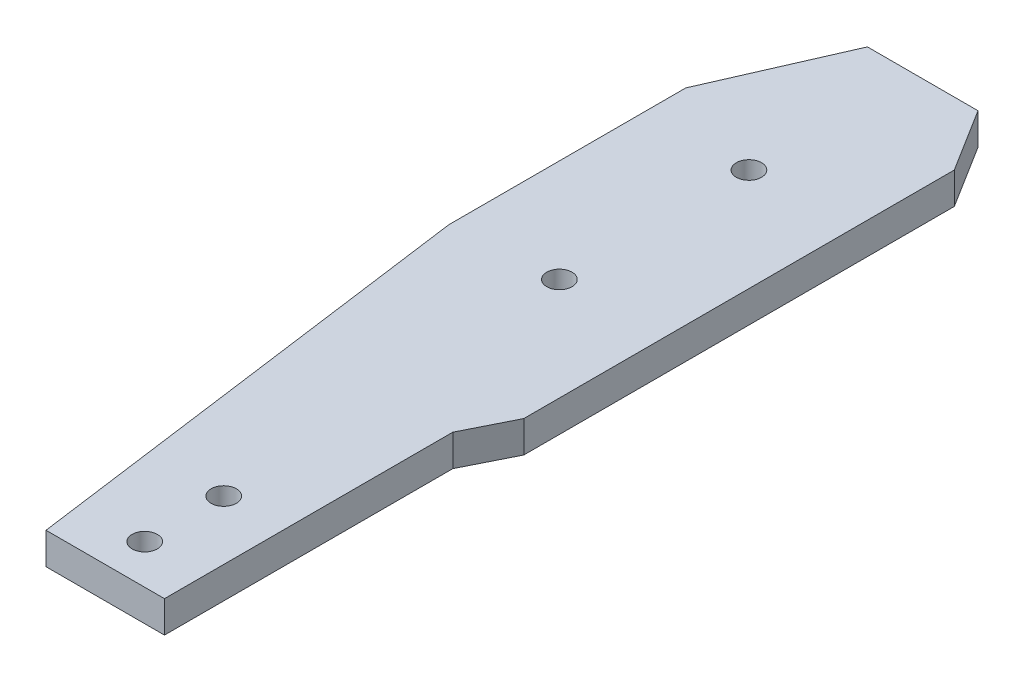
ISO-10303-21;
HEADER;
FILE_DESCRIPTION(('STEP AP214'),'2;1');
FILE_NAME('part.step','',(''),(''),'','','');
FILE_SCHEMA(('AUTOMOTIVE_DESIGN { 1 0 10303 214 1 1 1 1 }'));
ENDSEC;
DATA;
#1=APPLICATION_CONTEXT('core data for automotive mechanical design processes');
#2=APPLICATION_PROTOCOL_DEFINITION('international standard','automotive_design',2000,#1);
#3=PRODUCT_CONTEXT('',#1,'mechanical');
#4=PRODUCT('Part','Part','',(#3));
#5=PRODUCT_RELATED_PRODUCT_CATEGORY('part','',(#4));
#6=PRODUCT_DEFINITION_FORMATION('','',#4);
#7=PRODUCT_DEFINITION_CONTEXT('part definition',#1,'design');
#8=PRODUCT_DEFINITION('design','',#6,#7);
#9=PRODUCT_DEFINITION_SHAPE('','',#8);
#10=(LENGTH_UNIT() NAMED_UNIT(*) SI_UNIT(.MILLI.,.METRE.));
#11=(NAMED_UNIT(*) PLANE_ANGLE_UNIT() SI_UNIT($,.RADIAN.));
#12=(NAMED_UNIT(*) SI_UNIT($,.STERADIAN.) SOLID_ANGLE_UNIT());
#13=UNCERTAINTY_MEASURE_WITH_UNIT(LENGTH_MEASURE(1.E-05),#10,'distance_accuracy_value','');
#14=(GEOMETRIC_REPRESENTATION_CONTEXT(3) GLOBAL_UNCERTAINTY_ASSIGNED_CONTEXT((#13)) GLOBAL_UNIT_ASSIGNED_CONTEXT((#10,
#11,#12)) REPRESENTATION_CONTEXT('',''));
#15=CARTESIAN_POINT('',(0.,0.,0.));
#16=DIRECTION('',(0.,0.,1.));
#17=DIRECTION('',(1.,0.,0.));
#18=AXIS2_PLACEMENT_3D('',#15,#16,#17);
#19=CARTESIAN_POINT('',(-26.,4.,38.));
#20=DIRECTION('',(-1.,0.,0.));
#21=DIRECTION('',(0.,0.,1.));
#22=AXIS2_PLACEMENT_3D('',#19,#20,#21);
#23=PLANE('',#22);
#24=DIRECTION('',(0.,0.,-1.));
#25=VECTOR('',#24,1.);
#26=CARTESIAN_POINT('',(-26.,0.,38.));
#27=LINE('',#26,#25);
#28=CARTESIAN_POINT('',(-26.,0.,38.));
#29=VERTEX_POINT('',#28);
#30=CARTESIAN_POINT('',(-26.,0.,8.));
#31=VERTEX_POINT('',#30);
#32=EDGE_CURVE('E140',#29,#31,#27,.T.);
#33=ORIENTED_EDGE('',*,*,#32,.F.);
#34=DIRECTION('',(0.,-1.,0.));
#35=VECTOR('',#34,1.);
#36=CARTESIAN_POINT('',(-26.,4.,38.));
#37=LINE('',#36,#35);
#38=CARTESIAN_POINT('',(-26.,4.,38.));
#39=VERTEX_POINT('',#38);
#40=EDGE_CURVE('E11',#39,#29,#37,.T.);
#41=ORIENTED_EDGE('',*,*,#40,.F.);
#42=DIRECTION('',(0.,0.,-1.));
#43=VECTOR('',#42,1.);
#44=CARTESIAN_POINT('',(-26.,4.,38.));
#45=LINE('',#44,#43);
#46=CARTESIAN_POINT('',(-26.,4.,8.));
#47=VERTEX_POINT('',#46);
#48=EDGE_CURVE('E164',#39,#47,#45,.T.);
#49=ORIENTED_EDGE('',*,*,#48,.T.);
#50=DIRECTION('',(0.,-1.,0.));
#51=VECTOR('',#50,1.);
#52=CARTESIAN_POINT('',(-26.,4.,8.));
#53=LINE('',#52,#51);
#54=EDGE_CURVE('E40',#47,#31,#53,.T.);
#55=ORIENTED_EDGE('',*,*,#54,.T.);
#56=EDGE_LOOP('',(#33,#41,#49,#55));
#57=FACE_BOUND('',#56,.T.);
#58=ADVANCED_FACE('F37',(#57),#23,.T.);
#59=CARTESIAN_POINT('',(-18.,4.,97.));
#60=DIRECTION('',(-0.990932088180138,0.,0.134363672973578));
#61=DIRECTION('',(0.134363672973578,0.,0.990932088180138));
#62=AXIS2_PLACEMENT_3D('',#59,#60,#61);
#63=PLANE('',#62);
#64=DIRECTION('',(-0.134363672973578,0.,-0.990932088180138));
#65=VECTOR('',#64,1.);
#66=CARTESIAN_POINT('',(-18.,0.,97.));
#67=LINE('',#66,#65);
#68=CARTESIAN_POINT('',(-18.,0.,97.));
#69=VERTEX_POINT('',#68);
#70=EDGE_CURVE('E162',#69,#29,#67,.T.);
#71=ORIENTED_EDGE('',*,*,#70,.F.);
#72=DIRECTION('',(0.,-1.,0.));
#73=VECTOR('',#72,1.);
#74=CARTESIAN_POINT('',(-18.,4.,97.));
#75=LINE('',#74,#73);
#76=CARTESIAN_POINT('',(-18.,4.,97.));
#77=VERTEX_POINT('',#76);
#78=EDGE_CURVE('E46',#77,#69,#75,.T.);
#79=ORIENTED_EDGE('',*,*,#78,.F.);
#80=DIRECTION('',(-0.134363672973578,0.,-0.990932088180138));
#81=VECTOR('',#80,1.);
#82=CARTESIAN_POINT('',(-18.,4.,97.));
#83=LINE('',#82,#81);
#84=EDGE_CURVE('E130',#77,#39,#83,.T.);
#85=ORIENTED_EDGE('',*,*,#84,.T.);
#86=ORIENTED_EDGE('',*,*,#40,.T.);
#87=EDGE_LOOP('',(#71,#79,#85,#86));
#88=FACE_BOUND('',#87,.T.);
#89=ADVANCED_FACE('F178',(#88),#63,.T.);
#90=CARTESIAN_POINT('',(-2.99999999999999,4.,97.));
#91=DIRECTION('',(0.,0.,1.));
#92=DIRECTION('',(1.,0.,0.));
#93=AXIS2_PLACEMENT_3D('',#90,#91,#92);
#94=PLANE('',#93);
#95=DIRECTION('',(-1.,0.,0.));
#96=VECTOR('',#95,1.);
#97=CARTESIAN_POINT('',(-2.99999999999999,0.,97.));
#98=LINE('',#97,#96);
#99=CARTESIAN_POINT('',(-2.99999999999999,0.,97.));
#100=VERTEX_POINT('',#99);
#101=EDGE_CURVE('E117',#100,#69,#98,.T.);
#102=ORIENTED_EDGE('',*,*,#101,.F.);
#103=DIRECTION('',(0.,-1.,0.));
#104=VECTOR('',#103,1.);
#105=CARTESIAN_POINT('',(-2.99999999999999,4.,97.));
#106=LINE('',#105,#104);
#107=CARTESIAN_POINT('',(-2.99999999999999,4.,97.));
#108=VERTEX_POINT('',#107);
#109=EDGE_CURVE('E112',#108,#100,#106,.T.);
#110=ORIENTED_EDGE('',*,*,#109,.F.);
#111=DIRECTION('',(-1.,0.,0.));
#112=VECTOR('',#111,1.);
#113=CARTESIAN_POINT('',(-2.99999999999999,4.,97.));
#114=LINE('',#113,#112);
#115=EDGE_CURVE('E115',#108,#77,#114,.T.);
#116=ORIENTED_EDGE('',*,*,#115,.T.);
#117=ORIENTED_EDGE('',*,*,#78,.T.);
#118=EDGE_LOOP('',(#102,#110,#116,#117));
#119=FACE_BOUND('',#118,.T.);
#120=ADVANCED_FACE('F114',(#119),#94,.T.);
#121=CARTESIAN_POINT('',(-2.99999999999999,4.,60.5));
#122=DIRECTION('',(1.,0.,0.));
#123=DIRECTION('',(0.,0.,-1.));
#124=AXIS2_PLACEMENT_3D('',#121,#122,#123);
#125=PLANE('',#124);
#126=DIRECTION('',(0.,0.,1.));
#127=VECTOR('',#126,1.);
#128=CARTESIAN_POINT('',(-2.99999999999999,0.,60.5));
#129=LINE('',#128,#127);
#130=CARTESIAN_POINT('',(-2.99999999999999,0.,60.5));
#131=VERTEX_POINT('',#130);
#132=EDGE_CURVE('E159',#131,#100,#129,.T.);
#133=ORIENTED_EDGE('',*,*,#132,.F.);
#134=DIRECTION('',(0.,-1.,0.));
#135=VECTOR('',#134,1.);
#136=CARTESIAN_POINT('',(-2.99999999999999,4.,60.5));
#137=LINE('',#136,#135);
#138=CARTESIAN_POINT('',(-2.99999999999999,4.,60.5));
#139=VERTEX_POINT('',#138);
#140=EDGE_CURVE('E122',#139,#131,#137,.T.);
#141=ORIENTED_EDGE('',*,*,#140,.F.);
#142=DIRECTION('',(0.,0.,1.));
#143=VECTOR('',#142,1.);
#144=CARTESIAN_POINT('',(-2.99999999999999,4.,60.5));
#145=LINE('',#144,#143);
#146=EDGE_CURVE('E128',#139,#108,#145,.T.);
#147=ORIENTED_EDGE('',*,*,#146,.T.);
#148=ORIENTED_EDGE('',*,*,#109,.T.);
#149=EDGE_LOOP('',(#133,#141,#147,#148));
#150=FACE_BOUND('',#149,.T.);
#151=ADVANCED_FACE('F132',(#150),#125,.T.);
#152=CARTESIAN_POINT('',(0.,4.,54.5));
#153=DIRECTION('',(0.894427190999916,0.,0.447213595499958));
#154=DIRECTION('',(0.447213595499958,0.,-0.894427190999916));
#155=AXIS2_PLACEMENT_3D('',#152,#153,#154);
#156=PLANE('',#155);
#157=DIRECTION('',(-0.447213595499958,0.,0.894427190999916));
#158=VECTOR('',#157,1.);
#159=CARTESIAN_POINT('',(0.,0.,54.5));
#160=LINE('',#159,#158);
#161=CARTESIAN_POINT('',(0.,0.,54.5));
#162=VERTEX_POINT('',#161);
#163=EDGE_CURVE('E156',#162,#131,#160,.T.);
#164=ORIENTED_EDGE('',*,*,#163,.F.);
#165=DIRECTION('',(0.,-1.,0.));
#166=VECTOR('',#165,1.);
#167=CARTESIAN_POINT('',(0.,4.,54.5));
#168=LINE('',#167,#166);
#169=CARTESIAN_POINT('',(0.,4.,54.5));
#170=VERTEX_POINT('',#169);
#171=EDGE_CURVE('E168',#170,#162,#168,.T.);
#172=ORIENTED_EDGE('',*,*,#171,.F.);
#173=DIRECTION('',(-0.447213595499958,0.,0.894427190999916));
#174=VECTOR('',#173,1.);
#175=CARTESIAN_POINT('',(0.,4.,54.5));
#176=LINE('',#175,#174);
#177=EDGE_CURVE('E133',#170,#139,#176,.T.);
#178=ORIENTED_EDGE('',*,*,#177,.T.);
#179=ORIENTED_EDGE('',*,*,#140,.T.);
#180=EDGE_LOOP('',(#164,#172,#178,#179));
#181=FACE_BOUND('',#180,.T.);
#182=ADVANCED_FACE('F191',(#181),#156,.T.);
#183=CARTESIAN_POINT('',(0.,4.,0.));
#184=DIRECTION('',(1.,0.,0.));
#185=DIRECTION('',(0.,0.,-1.));
#186=AXIS2_PLACEMENT_3D('',#183,#184,#185);
#187=PLANE('',#186);
#188=DIRECTION('',(0.,0.,1.));
#189=VECTOR('',#188,1.);
#190=CARTESIAN_POINT('',(0.,0.,0.));
#191=LINE('',#190,#189);
#192=CARTESIAN_POINT('',(0.,0.,0.));
#193=VERTEX_POINT('',#192);
#194=EDGE_CURVE('E153',#193,#162,#191,.T.);
#195=ORIENTED_EDGE('',*,*,#194,.F.);
#196=DIRECTION('',(0.,-1.,0.));
#197=VECTOR('',#196,1.);
#198=CARTESIAN_POINT('',(0.,4.,0.));
#199=LINE('',#198,#197);
#200=CARTESIAN_POINT('',(0.,4.,0.));
#201=VERTEX_POINT('',#200);
#202=EDGE_CURVE('E170',#201,#193,#199,.T.);
#203=ORIENTED_EDGE('',*,*,#202,.F.);
#204=DIRECTION('',(0.,0.,1.));
#205=VECTOR('',#204,1.);
#206=CARTESIAN_POINT('',(0.,4.,0.));
#207=LINE('',#206,#205);
#208=EDGE_CURVE('E135',#201,#170,#207,.T.);
#209=ORIENTED_EDGE('',*,*,#208,.T.);
#210=ORIENTED_EDGE('',*,*,#171,.T.);
#211=EDGE_LOOP('',(#195,#203,#209,#210));
#212=FACE_BOUND('',#211,.T.);
#213=ADVANCED_FACE('F194',(#212),#187,.T.);
#214=CARTESIAN_POINT('',(-5.,4.,-8.));
#215=DIRECTION('',(0.847998304005088,0.,-0.52999894000318));
#216=DIRECTION('',(-0.52999894000318,0.,-0.847998304005088));
#217=AXIS2_PLACEMENT_3D('',#214,#215,#216);
#218=PLANE('',#217);
#219=DIRECTION('',(0.52999894000318,0.,0.847998304005088));
#220=VECTOR('',#219,1.);
#221=CARTESIAN_POINT('',(-5.,0.,-8.));
#222=LINE('',#221,#220);
#223=CARTESIAN_POINT('',(-5.,0.,-8.));
#224=VERTEX_POINT('',#223);
#225=EDGE_CURVE('E150',#224,#193,#222,.T.);
#226=ORIENTED_EDGE('',*,*,#225,.F.);
#227=DIRECTION('',(0.,-1.,0.));
#228=VECTOR('',#227,1.);
#229=CARTESIAN_POINT('',(-5.,4.,-8.));
#230=LINE('',#229,#228);
#231=CARTESIAN_POINT('',(-5.,4.,-8.));
#232=VERTEX_POINT('',#231);
#233=EDGE_CURVE('E172',#232,#224,#230,.T.);
#234=ORIENTED_EDGE('',*,*,#233,.F.);
#235=DIRECTION('',(0.52999894000318,0.,0.847998304005088));
#236=VECTOR('',#235,1.);
#237=CARTESIAN_POINT('',(-5.,4.,-8.));
#238=LINE('',#237,#236);
#239=EDGE_CURVE('E267',#232,#201,#238,.T.);
#240=ORIENTED_EDGE('',*,*,#239,.T.);
#241=ORIENTED_EDGE('',*,*,#202,.T.);
#242=EDGE_LOOP('',(#226,#234,#240,#241));
#243=FACE_BOUND('',#242,.T.);
#244=ADVANCED_FACE('F198',(#243),#218,.T.);
#245=CARTESIAN_POINT('',(-19.,4.,-8.));
#246=DIRECTION('',(0.,0.,-1.));
#247=DIRECTION('',(-1.,0.,0.));
#248=AXIS2_PLACEMENT_3D('',#245,#246,#247);
#249=PLANE('',#248);
#250=DIRECTION('',(1.,0.,0.));
#251=VECTOR('',#250,1.);
#252=CARTESIAN_POINT('',(-19.,0.,-8.));
#253=LINE('',#252,#251);
#254=CARTESIAN_POINT('',(-19.,0.,-8.));
#255=VERTEX_POINT('',#254);
#256=EDGE_CURVE('E147',#255,#224,#253,.T.);
#257=ORIENTED_EDGE('',*,*,#256,.F.);
#258=DIRECTION('',(0.,-1.,0.));
#259=VECTOR('',#258,1.);
#260=CARTESIAN_POINT('',(-19.,4.,-8.));
#261=LINE('',#260,#259);
#262=CARTESIAN_POINT('',(-19.,4.,-8.));
#263=VERTEX_POINT('',#262);
#264=EDGE_CURVE('E173',#263,#255,#261,.T.);
#265=ORIENTED_EDGE('',*,*,#264,.F.);
#266=DIRECTION('',(1.,0.,0.));
#267=VECTOR('',#266,1.);
#268=CARTESIAN_POINT('',(-19.,4.,-8.));
#269=LINE('',#268,#267);
#270=EDGE_CURVE('E264',#263,#232,#269,.T.);
#271=ORIENTED_EDGE('',*,*,#270,.T.);
#272=ORIENTED_EDGE('',*,*,#233,.T.);
#273=EDGE_LOOP('',(#257,#265,#271,#272));
#274=FACE_BOUND('',#273,.T.);
#275=ADVANCED_FACE('F202',(#274),#249,.T.);
#276=CARTESIAN_POINT('',(-26.,4.,8.));
#277=DIRECTION('',(-0.916157334902189,0.,-0.400818834019707));
#278=DIRECTION('',(-0.400818834019707,0.,0.91615733490219));
#279=AXIS2_PLACEMENT_3D('',#276,#277,#278);
#280=PLANE('',#279);
#281=DIRECTION('',(0.400818834019707,0.,-0.91615733490219));
#282=VECTOR('',#281,1.);
#283=CARTESIAN_POINT('',(-26.,0.,8.));
#284=LINE('',#283,#282);
#285=EDGE_CURVE('E143',#31,#255,#284,.T.);
#286=ORIENTED_EDGE('',*,*,#285,.F.);
#287=ORIENTED_EDGE('',*,*,#54,.F.);
#288=DIRECTION('',(0.400818834019707,0.,-0.91615733490219));
#289=VECTOR('',#288,1.);
#290=CARTESIAN_POINT('',(-26.,4.,8.));
#291=LINE('',#290,#289);
#292=EDGE_CURVE('E262',#47,#263,#291,.T.);
#293=ORIENTED_EDGE('',*,*,#292,.T.);
#294=ORIENTED_EDGE('',*,*,#264,.T.);
#295=EDGE_LOOP('',(#286,#287,#293,#294));
#296=FACE_BOUND('',#295,.T.);
#297=ADVANCED_FACE('F175',(#296),#280,.T.);
#298=CARTESIAN_POINT('',(0.,4.,0.));
#299=DIRECTION('',(0.,-1.,0.));
#300=DIRECTION('',(0.,0.,-1.));
#301=AXIS2_PLACEMENT_3D('',#298,#299,#300);
#302=PLANE('',#301);
#303=CARTESIAN_POINT('',(-13.,4.,13.));
#304=DIRECTION('',(0.,1.,0.));
#305=DIRECTION('',(0.,0.,1.));
#306=AXIS2_PLACEMENT_3D('',#303,#304,#305);
#307=CIRCLE('',#306,1.6);
#308=CARTESIAN_POINT('',(-13.,4.,14.6));
#309=VERTEX_POINT('',#308);
#310=EDGE_CURVE('E239',#309,#309,#307,.T.);
#311=ORIENTED_EDGE('',*,*,#310,.F.);
#312=EDGE_LOOP('',(#311));
#313=FACE_BOUND('',#312,.T.);
#314=CARTESIAN_POINT('',(-13.,4.,37.));
#315=DIRECTION('',(0.,1.,0.));
#316=DIRECTION('',(0.,0.,1.));
#317=AXIS2_PLACEMENT_3D('',#314,#315,#316);
#318=CIRCLE('',#317,1.6);
#319=CARTESIAN_POINT('',(-13.,4.,38.6));
#320=VERTEX_POINT('',#319);
#321=EDGE_CURVE('E244',#320,#320,#318,.T.);
#322=ORIENTED_EDGE('',*,*,#321,.F.);
#323=EDGE_LOOP('',(#322));
#324=FACE_BOUND('',#323,.T.);
#325=CARTESIAN_POINT('',(-10.5,4.,82.));
#326=DIRECTION('',(0.,1.,0.));
#327=DIRECTION('',(0.,0.,1.));
#328=AXIS2_PLACEMENT_3D('',#325,#326,#327);
#329=CIRCLE('',#328,1.6);
#330=CARTESIAN_POINT('',(-10.5,4.,83.6));
#331=VERTEX_POINT('',#330);
#332=EDGE_CURVE('E252',#331,#331,#329,.T.);
#333=ORIENTED_EDGE('',*,*,#332,.F.);
#334=EDGE_LOOP('',(#333));
#335=FACE_BOUND('',#334,.T.);
#336=CARTESIAN_POINT('',(-10.5,4.,92.));
#337=DIRECTION('',(0.,1.,0.));
#338=DIRECTION('',(0.,0.,1.));
#339=AXIS2_PLACEMENT_3D('',#336,#337,#338);
#340=CIRCLE('',#339,1.6);
#341=CARTESIAN_POINT('',(-10.5,4.,93.6));
#342=VERTEX_POINT('',#341);
#343=EDGE_CURVE('E258',#342,#342,#340,.T.);
#344=ORIENTED_EDGE('',*,*,#343,.F.);
#345=EDGE_LOOP('',(#344));
#346=FACE_BOUND('',#345,.T.);
#347=ORIENTED_EDGE('',*,*,#48,.F.);
#348=ORIENTED_EDGE('',*,*,#84,.F.);
#349=ORIENTED_EDGE('',*,*,#115,.F.);
#350=ORIENTED_EDGE('',*,*,#146,.F.);
#351=ORIENTED_EDGE('',*,*,#177,.F.);
#352=ORIENTED_EDGE('',*,*,#208,.F.);
#353=ORIENTED_EDGE('',*,*,#239,.F.);
#354=ORIENTED_EDGE('',*,*,#270,.F.);
#355=ORIENTED_EDGE('',*,*,#292,.F.);
#356=EDGE_LOOP('',(#347,#348,#349,#350,#351,#352,#353,#354,#355));
#357=FACE_BOUND('',#356,.T.);
#358=ADVANCED_FACE('F126',(#313,#324,#335,#346,#357),#302,.F.);
#359=CARTESIAN_POINT('',(0.,0.,0.));
#360=DIRECTION('',(0.,-1.,0.));
#361=DIRECTION('',(0.,0.,-1.));
#362=AXIS2_PLACEMENT_3D('',#359,#360,#361);
#363=PLANE('',#362);
#364=CARTESIAN_POINT('',(-13.,0.,13.));
#365=DIRECTION('',(0.,1.,0.));
#366=DIRECTION('',(0.,0.,1.));
#367=AXIS2_PLACEMENT_3D('',#364,#365,#366);
#368=CIRCLE('',#367,1.6);
#369=CARTESIAN_POINT('',(-13.,0.,14.6));
#370=VERTEX_POINT('',#369);
#371=EDGE_CURVE('E144',#370,#370,#368,.T.);
#372=ORIENTED_EDGE('',*,*,#371,.T.);
#373=EDGE_LOOP('',(#372));
#374=FACE_BOUND('',#373,.T.);
#375=CARTESIAN_POINT('',(-13.,0.,37.));
#376=DIRECTION('',(0.,1.,0.));
#377=DIRECTION('',(0.,0.,1.));
#378=AXIS2_PLACEMENT_3D('',#375,#376,#377);
#379=CIRCLE('',#378,1.6);
#380=CARTESIAN_POINT('',(-13.,0.,38.6));
#381=VERTEX_POINT('',#380);
#382=EDGE_CURVE('E240',#381,#381,#379,.T.);
#383=ORIENTED_EDGE('',*,*,#382,.T.);
#384=EDGE_LOOP('',(#383));
#385=FACE_BOUND('',#384,.T.);
#386=CARTESIAN_POINT('',(-10.5,0.,82.));
#387=DIRECTION('',(0.,1.,0.));
#388=DIRECTION('',(0.,0.,1.));
#389=AXIS2_PLACEMENT_3D('',#386,#387,#388);
#390=CIRCLE('',#389,1.6);
#391=CARTESIAN_POINT('',(-10.5,0.,83.6));
#392=VERTEX_POINT('',#391);
#393=EDGE_CURVE('E249',#392,#392,#390,.T.);
#394=ORIENTED_EDGE('',*,*,#393,.T.);
#395=EDGE_LOOP('',(#394));
#396=FACE_BOUND('',#395,.T.);
#397=CARTESIAN_POINT('',(-10.5,0.,92.));
#398=DIRECTION('',(0.,1.,0.));
#399=DIRECTION('',(0.,0.,1.));
#400=AXIS2_PLACEMENT_3D('',#397,#398,#399);
#401=CIRCLE('',#400,1.6);
#402=CARTESIAN_POINT('',(-10.5,0.,93.6));
#403=VERTEX_POINT('',#402);
#404=EDGE_CURVE('E255',#403,#403,#401,.T.);
#405=ORIENTED_EDGE('',*,*,#404,.T.);
#406=EDGE_LOOP('',(#405));
#407=FACE_BOUND('',#406,.T.);
#408=ORIENTED_EDGE('',*,*,#32,.T.);
#409=ORIENTED_EDGE('',*,*,#285,.T.);
#410=ORIENTED_EDGE('',*,*,#256,.T.);
#411=ORIENTED_EDGE('',*,*,#225,.T.);
#412=ORIENTED_EDGE('',*,*,#194,.T.);
#413=ORIENTED_EDGE('',*,*,#163,.T.);
#414=ORIENTED_EDGE('',*,*,#132,.T.);
#415=ORIENTED_EDGE('',*,*,#101,.T.);
#416=ORIENTED_EDGE('',*,*,#70,.T.);
#417=EDGE_LOOP('',(#408,#409,#410,#411,#412,#413,#414,#415,#416));
#418=FACE_BOUND('',#417,.T.);
#419=ADVANCED_FACE('F177',(#374,#385,#396,#407,#418),#363,.T.);
#420=CARTESIAN_POINT('',(-10.5,0.,92.));
#421=DIRECTION('',(0.,1.,0.));
#422=DIRECTION('',(0.,0.,1.));
#423=AXIS2_PLACEMENT_3D('',#420,#421,#422);
#424=CYLINDRICAL_SURFACE('',#423,1.6);
#425=ORIENTED_EDGE('',*,*,#404,.F.);
#426=EDGE_LOOP('',(#425));
#427=FACE_BOUND('',#426,.T.);
#428=ORIENTED_EDGE('',*,*,#343,.T.);
#429=EDGE_LOOP('',(#428));
#430=FACE_BOUND('',#429,.T.);
#431=ADVANCED_FACE('F214',(#427,#430),#424,.F.);
#432=CARTESIAN_POINT('',(-10.5,0.,82.));
#433=DIRECTION('',(0.,1.,0.));
#434=DIRECTION('',(0.,0.,1.));
#435=AXIS2_PLACEMENT_3D('',#432,#433,#434);
#436=CYLINDRICAL_SURFACE('',#435,1.6);
#437=ORIENTED_EDGE('',*,*,#393,.F.);
#438=EDGE_LOOP('',(#437));
#439=FACE_BOUND('',#438,.T.);
#440=ORIENTED_EDGE('',*,*,#332,.T.);
#441=EDGE_LOOP('',(#440));
#442=FACE_BOUND('',#441,.T.);
#443=ADVANCED_FACE('F221',(#439,#442),#436,.F.);
#444=CARTESIAN_POINT('',(-13.,0.,37.));
#445=DIRECTION('',(0.,1.,0.));
#446=DIRECTION('',(0.,0.,1.));
#447=AXIS2_PLACEMENT_3D('',#444,#445,#446);
#448=CYLINDRICAL_SURFACE('',#447,1.6);
#449=ORIENTED_EDGE('',*,*,#382,.F.);
#450=EDGE_LOOP('',(#449));
#451=FACE_BOUND('',#450,.T.);
#452=ORIENTED_EDGE('',*,*,#321,.T.);
#453=EDGE_LOOP('',(#452));
#454=FACE_BOUND('',#453,.T.);
#455=ADVANCED_FACE('F225',(#451,#454),#448,.F.);
#456=CARTESIAN_POINT('',(-13.,0.,13.));
#457=DIRECTION('',(0.,1.,0.));
#458=DIRECTION('',(0.,0.,1.));
#459=AXIS2_PLACEMENT_3D('',#456,#457,#458);
#460=CYLINDRICAL_SURFACE('',#459,1.6);
#461=ORIENTED_EDGE('',*,*,#371,.F.);
#462=EDGE_LOOP('',(#461));
#463=FACE_BOUND('',#462,.T.);
#464=ORIENTED_EDGE('',*,*,#310,.T.);
#465=EDGE_LOOP('',(#464));
#466=FACE_BOUND('',#465,.T.);
#467=ADVANCED_FACE('F229',(#463,#466),#460,.F.);
#468=CLOSED_SHELL('',(#58,#89,#120,#151,#182,#213,#244,#275,#297,#358,#419,#431,#443,#455,#467));
#469=MANIFOLD_SOLID_BREP('B2',#468);
#470=ADVANCED_BREP_SHAPE_REPRESENTATION('',(#18,#469),#14);
#471=SHAPE_DEFINITION_REPRESENTATION(#9,#470);
ENDSEC;
END-ISO-10303-21;
